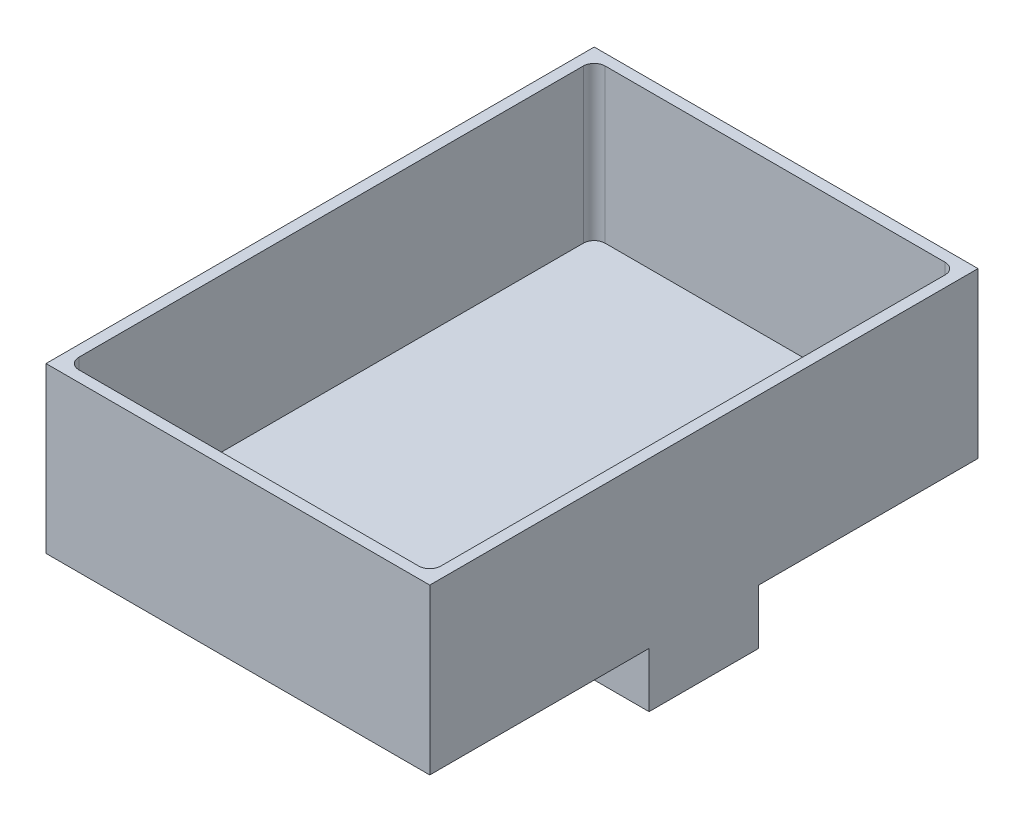
ISO-10303-21;
HEADER;
FILE_DESCRIPTION(('STEP AP214'),'2;1');
FILE_NAME('part.step','',(''),(''),'','','');
FILE_SCHEMA(('AUTOMOTIVE_DESIGN { 1 0 10303 214 1 1 1 1 }'));
ENDSEC;
DATA;
#1=APPLICATION_CONTEXT('core data for automotive mechanical design processes');
#2=APPLICATION_PROTOCOL_DEFINITION('international standard','automotive_design',2000,#1);
#3=PRODUCT_CONTEXT('',#1,'mechanical');
#4=PRODUCT('Part','Part','',(#3));
#5=PRODUCT_RELATED_PRODUCT_CATEGORY('part','',(#4));
#6=PRODUCT_DEFINITION_FORMATION('','',#4);
#7=PRODUCT_DEFINITION_CONTEXT('part definition',#1,'design');
#8=PRODUCT_DEFINITION('design','',#6,#7);
#9=PRODUCT_DEFINITION_SHAPE('','',#8);
#10=(LENGTH_UNIT() NAMED_UNIT(*) SI_UNIT(.MILLI.,.METRE.));
#11=(NAMED_UNIT(*) PLANE_ANGLE_UNIT() SI_UNIT($,.RADIAN.));
#12=(NAMED_UNIT(*) SI_UNIT($,.STERADIAN.) SOLID_ANGLE_UNIT());
#13=UNCERTAINTY_MEASURE_WITH_UNIT(LENGTH_MEASURE(1.E-05),#10,'distance_accuracy_value','');
#14=(GEOMETRIC_REPRESENTATION_CONTEXT(3) GLOBAL_UNCERTAINTY_ASSIGNED_CONTEXT((#13)) GLOBAL_UNIT_ASSIGNED_CONTEXT((#10,
#11,#12)) REPRESENTATION_CONTEXT('',''));
#15=CARTESIAN_POINT('',(0.,0.,0.));
#16=DIRECTION('',(0.,0.,1.));
#17=DIRECTION('',(1.,0.,0.));
#18=AXIS2_PLACEMENT_3D('',#15,#16,#17);
#19=CARTESIAN_POINT('',(70.,40.,0.));
#20=DIRECTION('',(0.,-1.,0.));
#21=DIRECTION('',(0.,0.,-1.));
#22=AXIS2_PLACEMENT_3D('',#19,#20,#21);
#23=PLANE('',#22);
#24=DIRECTION('',(0.,0.,1.));
#25=VECTOR('',#24,1.);
#26=CARTESIAN_POINT('',(0.,40.,0.));
#27=LINE('',#26,#25);
#28=CARTESIAN_POINT('',(0.,40.,-100.));
#29=VERTEX_POINT('',#28);
#30=CARTESIAN_POINT('',(0.,40.,0.));
#31=VERTEX_POINT('',#30);
#32=EDGE_CURVE('E258',#29,#31,#27,.T.);
#33=ORIENTED_EDGE('',*,*,#32,.T.);
#34=DIRECTION('',(-1.,0.,0.));
#35=VECTOR('',#34,1.);
#36=CARTESIAN_POINT('',(70.,40.,0.));
#37=LINE('',#36,#35);
#38=CARTESIAN_POINT('',(70.,40.,0.));
#39=VERTEX_POINT('',#38);
#40=EDGE_CURVE('E153',#39,#31,#37,.T.);
#41=ORIENTED_EDGE('',*,*,#40,.F.);
#42=DIRECTION('',(0.,0.,1.));
#43=VECTOR('',#42,1.);
#44=CARTESIAN_POINT('',(70.,40.,0.));
#45=LINE('',#44,#43);
#46=CARTESIAN_POINT('',(70.,40.,-100.));
#47=VERTEX_POINT('',#46);
#48=EDGE_CURVE('E147',#47,#39,#45,.T.);
#49=ORIENTED_EDGE('',*,*,#48,.F.);
#50=DIRECTION('',(-1.,0.,0.));
#51=VECTOR('',#50,1.);
#52=CARTESIAN_POINT('',(70.,40.,-100.));
#53=LINE('',#52,#51);
#54=EDGE_CURVE('E150',#47,#29,#53,.T.);
#55=ORIENTED_EDGE('',*,*,#54,.T.);
#56=EDGE_LOOP('',(#33,#41,#49,#55));
#57=FACE_BOUND('',#56,.T.);
#58=DIRECTION('',(0.,0.,1.));
#59=VECTOR('',#58,1.);
#60=CARTESIAN_POINT('',(2.,40.,0.));
#61=LINE('',#60,#59);
#62=CARTESIAN_POINT('',(2.,40.,-96.));
#63=VERTEX_POINT('',#62);
#64=CARTESIAN_POINT('',(2.,40.,-4.));
#65=VERTEX_POINT('',#64);
#66=EDGE_CURVE('E239',#63,#65,#61,.T.);
#67=ORIENTED_EDGE('',*,*,#66,.F.);
#68=CARTESIAN_POINT('',(4.,40.,-96.));
#69=DIRECTION('',(0.,-1.,0.));
#70=DIRECTION('',(0.,0.,-1.));
#71=AXIS2_PLACEMENT_3D('',#68,#69,#70);
#72=CIRCLE('',#71,2.);
#73=CARTESIAN_POINT('',(4.,40.,-98.));
#74=VERTEX_POINT('',#73);
#75=EDGE_CURVE('E11',#63,#74,#72,.T.);
#76=ORIENTED_EDGE('',*,*,#75,.T.);
#77=DIRECTION('',(-1.,0.,0.));
#78=VECTOR('',#77,1.);
#79=CARTESIAN_POINT('',(70.,40.,-98.));
#80=LINE('',#79,#78);
#81=CARTESIAN_POINT('',(66.,40.,-98.));
#82=VERTEX_POINT('',#81);
#83=EDGE_CURVE('E210',#82,#74,#80,.T.);
#84=ORIENTED_EDGE('',*,*,#83,.F.);
#85=CARTESIAN_POINT('',(66.,40.,-96.));
#86=DIRECTION('',(0.,-1.,0.));
#87=DIRECTION('',(0.,0.,-1.));
#88=AXIS2_PLACEMENT_3D('',#85,#86,#87);
#89=CIRCLE('',#88,2.);
#90=CARTESIAN_POINT('',(68.,40.,-96.));
#91=VERTEX_POINT('',#90);
#92=EDGE_CURVE('E43',#82,#91,#89,.T.);
#93=ORIENTED_EDGE('',*,*,#92,.T.);
#94=DIRECTION('',(0.,0.,1.));
#95=VECTOR('',#94,1.);
#96=CARTESIAN_POINT('',(68.,40.,0.));
#97=LINE('',#96,#95);
#98=CARTESIAN_POINT('',(68.,40.,-4.));
#99=VERTEX_POINT('',#98);
#100=EDGE_CURVE('E208',#91,#99,#97,.T.);
#101=ORIENTED_EDGE('',*,*,#100,.T.);
#102=CARTESIAN_POINT('',(66.,40.,-4.));
#103=DIRECTION('',(0.,-1.,0.));
#104=DIRECTION('',(0.,0.,-1.));
#105=AXIS2_PLACEMENT_3D('',#102,#103,#104);
#106=CIRCLE('',#105,2.);
#107=CARTESIAN_POINT('',(66.,40.,-2.));
#108=VERTEX_POINT('',#107);
#109=EDGE_CURVE('E203',#99,#108,#106,.T.);
#110=ORIENTED_EDGE('',*,*,#109,.T.);
#111=DIRECTION('',(-1.,0.,0.));
#112=VECTOR('',#111,1.);
#113=CARTESIAN_POINT('',(70.,40.,-2.));
#114=LINE('',#113,#112);
#115=CARTESIAN_POINT('',(4.,40.,-2.));
#116=VERTEX_POINT('',#115);
#117=EDGE_CURVE('E234',#108,#116,#114,.T.);
#118=ORIENTED_EDGE('',*,*,#117,.T.);
#119=CARTESIAN_POINT('',(4.,40.,-4.));
#120=DIRECTION('',(0.,-1.,0.));
#121=DIRECTION('',(0.,0.,-1.));
#122=AXIS2_PLACEMENT_3D('',#119,#120,#121);
#123=CIRCLE('',#122,2.);
#124=EDGE_CURVE('E205',#116,#65,#123,.T.);
#125=ORIENTED_EDGE('',*,*,#124,.T.);
#126=EDGE_LOOP('',(#67,#76,#84,#93,#101,#110,#118,#125));
#127=FACE_BOUND('',#126,.T.);
#128=ADVANCED_FACE('F35',(#57,#127),#23,.F.);
#129=CARTESIAN_POINT('',(70.,10.,-100.));
#130=DIRECTION('',(0.,0.,1.));
#131=DIRECTION('',(1.,0.,0.));
#132=AXIS2_PLACEMENT_3D('',#129,#130,#131);
#133=PLANE('',#132);
#134=DIRECTION('',(0.,1.,0.));
#135=VECTOR('',#134,1.);
#136=CARTESIAN_POINT('',(0.,10.,-100.));
#137=LINE('',#136,#135);
#138=CARTESIAN_POINT('',(0.,10.,-100.));
#139=VERTEX_POINT('',#138);
#140=EDGE_CURVE('E170',#139,#29,#137,.T.);
#141=ORIENTED_EDGE('',*,*,#140,.T.);
#142=ORIENTED_EDGE('',*,*,#54,.F.);
#143=DIRECTION('',(0.,1.,0.));
#144=VECTOR('',#143,1.);
#145=CARTESIAN_POINT('',(70.,10.,-100.));
#146=LINE('',#145,#144);
#147=CARTESIAN_POINT('',(70.,10.,-100.));
#148=VERTEX_POINT('',#147);
#149=EDGE_CURVE('E157',#148,#47,#146,.T.);
#150=ORIENTED_EDGE('',*,*,#149,.F.);
#151=DIRECTION('',(-1.,0.,0.));
#152=VECTOR('',#151,1.);
#153=CARTESIAN_POINT('',(70.,10.,-100.));
#154=LINE('',#153,#152);
#155=EDGE_CURVE('E256',#148,#139,#154,.T.);
#156=ORIENTED_EDGE('',*,*,#155,.T.);
#157=EDGE_LOOP('',(#141,#142,#150,#156));
#158=FACE_BOUND('',#157,.T.);
#159=ADVANCED_FACE('F168',(#158),#133,.F.);
#160=CARTESIAN_POINT('',(70.,10.,0.));
#161=DIRECTION('',(0.,0.,-1.));
#162=DIRECTION('',(-1.,0.,0.));
#163=AXIS2_PLACEMENT_3D('',#160,#161,#162);
#164=PLANE('',#163);
#165=DIRECTION('',(0.,-1.,0.));
#166=VECTOR('',#165,1.);
#167=CARTESIAN_POINT('',(0.,10.,0.));
#168=LINE('',#167,#166);
#169=CARTESIAN_POINT('',(0.,10.,0.));
#170=VERTEX_POINT('',#169);
#171=EDGE_CURVE('E260',#31,#170,#168,.T.);
#172=ORIENTED_EDGE('',*,*,#171,.T.);
#173=DIRECTION('',(-1.,0.,0.));
#174=VECTOR('',#173,1.);
#175=CARTESIAN_POINT('',(70.,10.,0.));
#176=LINE('',#175,#174);
#177=CARTESIAN_POINT('',(70.,10.,0.));
#178=VERTEX_POINT('',#177);
#179=EDGE_CURVE('E175',#178,#170,#176,.T.);
#180=ORIENTED_EDGE('',*,*,#179,.F.);
#181=DIRECTION('',(0.,-1.,0.));
#182=VECTOR('',#181,1.);
#183=CARTESIAN_POINT('',(70.,10.,0.));
#184=LINE('',#183,#182);
#185=EDGE_CURVE('E156',#39,#178,#184,.T.);
#186=ORIENTED_EDGE('',*,*,#185,.F.);
#187=ORIENTED_EDGE('',*,*,#40,.T.);
#188=EDGE_LOOP('',(#172,#180,#186,#187));
#189=FACE_BOUND('',#188,.T.);
#190=ADVANCED_FACE('F307',(#189),#164,.F.);
#191=CARTESIAN_POINT('',(70.,10.,0.));
#192=DIRECTION('',(0.,1.,0.));
#193=DIRECTION('',(0.,0.,1.));
#194=AXIS2_PLACEMENT_3D('',#191,#192,#193);
#195=PLANE('',#194);
#196=DIRECTION('',(0.,0.,-1.));
#197=VECTOR('',#196,1.);
#198=CARTESIAN_POINT('',(0.,10.,0.));
#199=LINE('',#198,#197);
#200=CARTESIAN_POINT('',(0.,10.,-40.));
#201=VERTEX_POINT('',#200);
#202=EDGE_CURVE('E262',#170,#201,#199,.T.);
#203=ORIENTED_EDGE('',*,*,#202,.T.);
#204=DIRECTION('',(-1.,0.,0.));
#205=VECTOR('',#204,1.);
#206=CARTESIAN_POINT('',(70.,10.,-40.));
#207=LINE('',#206,#205);
#208=CARTESIAN_POINT('',(70.,10.,-40.));
#209=VERTEX_POINT('',#208);
#210=EDGE_CURVE('E281',#209,#201,#207,.T.);
#211=ORIENTED_EDGE('',*,*,#210,.F.);
#212=DIRECTION('',(0.,0.,-1.));
#213=VECTOR('',#212,1.);
#214=CARTESIAN_POINT('',(70.,10.,0.));
#215=LINE('',#214,#213);
#216=EDGE_CURVE('E247',#178,#209,#215,.T.);
#217=ORIENTED_EDGE('',*,*,#216,.F.);
#218=ORIENTED_EDGE('',*,*,#179,.T.);
#219=EDGE_LOOP('',(#203,#211,#217,#218));
#220=FACE_BOUND('',#219,.T.);
#221=ADVANCED_FACE('F288',(#220),#195,.F.);
#222=CARTESIAN_POINT('',(70.,0.,-40.));
#223=DIRECTION('',(0.,0.,-1.));
#224=DIRECTION('',(-1.,0.,0.));
#225=AXIS2_PLACEMENT_3D('',#222,#223,#224);
#226=PLANE('',#225);
#227=DIRECTION('',(0.,-1.,0.));
#228=VECTOR('',#227,1.);
#229=CARTESIAN_POINT('',(0.,0.,-40.));
#230=LINE('',#229,#228);
#231=CARTESIAN_POINT('',(0.,0.,-40.));
#232=VERTEX_POINT('',#231);
#233=EDGE_CURVE('E264',#201,#232,#230,.T.);
#234=ORIENTED_EDGE('',*,*,#233,.T.);
#235=DIRECTION('',(-1.,0.,0.));
#236=VECTOR('',#235,1.);
#237=CARTESIAN_POINT('',(70.,0.,-40.));
#238=LINE('',#237,#236);
#239=CARTESIAN_POINT('',(70.,0.,-40.));
#240=VERTEX_POINT('',#239);
#241=EDGE_CURVE('E278',#240,#232,#238,.T.);
#242=ORIENTED_EDGE('',*,*,#241,.F.);
#243=DIRECTION('',(0.,-1.,0.));
#244=VECTOR('',#243,1.);
#245=CARTESIAN_POINT('',(70.,0.,-40.));
#246=LINE('',#245,#244);
#247=EDGE_CURVE('E249',#209,#240,#246,.T.);
#248=ORIENTED_EDGE('',*,*,#247,.F.);
#249=ORIENTED_EDGE('',*,*,#210,.T.);
#250=EDGE_LOOP('',(#234,#242,#248,#249));
#251=FACE_BOUND('',#250,.T.);
#252=ADVANCED_FACE('F299',(#251),#226,.F.);
#253=CARTESIAN_POINT('',(70.,0.,-40.));
#254=DIRECTION('',(0.,1.,0.));
#255=DIRECTION('',(0.,0.,1.));
#256=AXIS2_PLACEMENT_3D('',#253,#254,#255);
#257=PLANE('',#256);
#258=DIRECTION('',(0.,0.,-1.));
#259=VECTOR('',#258,1.);
#260=CARTESIAN_POINT('',(0.,0.,-40.));
#261=LINE('',#260,#259);
#262=CARTESIAN_POINT('',(0.,0.,-60.));
#263=VERTEX_POINT('',#262);
#264=EDGE_CURVE('E266',#232,#263,#261,.T.);
#265=ORIENTED_EDGE('',*,*,#264,.T.);
#266=DIRECTION('',(-1.,0.,0.));
#267=VECTOR('',#266,1.);
#268=CARTESIAN_POINT('',(70.,0.,-60.));
#269=LINE('',#268,#267);
#270=CARTESIAN_POINT('',(70.,0.,-60.));
#271=VERTEX_POINT('',#270);
#272=EDGE_CURVE('E275',#271,#263,#269,.T.);
#273=ORIENTED_EDGE('',*,*,#272,.F.);
#274=DIRECTION('',(0.,0.,-1.));
#275=VECTOR('',#274,1.);
#276=CARTESIAN_POINT('',(70.,0.,-40.));
#277=LINE('',#276,#275);
#278=EDGE_CURVE('E251',#240,#271,#277,.T.);
#279=ORIENTED_EDGE('',*,*,#278,.F.);
#280=ORIENTED_EDGE('',*,*,#241,.T.);
#281=EDGE_LOOP('',(#265,#273,#279,#280));
#282=FACE_BOUND('',#281,.T.);
#283=ADVANCED_FACE('F303',(#282),#257,.F.);
#284=CARTESIAN_POINT('',(70.,0.,-60.));
#285=DIRECTION('',(0.,0.,1.));
#286=DIRECTION('',(1.,0.,0.));
#287=AXIS2_PLACEMENT_3D('',#284,#285,#286);
#288=PLANE('',#287);
#289=DIRECTION('',(0.,1.,0.));
#290=VECTOR('',#289,1.);
#291=CARTESIAN_POINT('',(0.,0.,-60.));
#292=LINE('',#291,#290);
#293=CARTESIAN_POINT('',(0.,10.,-60.));
#294=VERTEX_POINT('',#293);
#295=EDGE_CURVE('E268',#263,#294,#292,.T.);
#296=ORIENTED_EDGE('',*,*,#295,.T.);
#297=DIRECTION('',(-1.,0.,0.));
#298=VECTOR('',#297,1.);
#299=CARTESIAN_POINT('',(70.,10.,-60.));
#300=LINE('',#299,#298);
#301=CARTESIAN_POINT('',(70.,10.,-60.));
#302=VERTEX_POINT('',#301);
#303=EDGE_CURVE('E272',#302,#294,#300,.T.);
#304=ORIENTED_EDGE('',*,*,#303,.F.);
#305=DIRECTION('',(0.,1.,0.));
#306=VECTOR('',#305,1.);
#307=CARTESIAN_POINT('',(70.,0.,-60.));
#308=LINE('',#307,#306);
#309=EDGE_CURVE('E253',#271,#302,#308,.T.);
#310=ORIENTED_EDGE('',*,*,#309,.F.);
#311=ORIENTED_EDGE('',*,*,#272,.T.);
#312=EDGE_LOOP('',(#296,#304,#310,#311));
#313=FACE_BOUND('',#312,.T.);
#314=ADVANCED_FACE('F366',(#313),#288,.F.);
#315=CARTESIAN_POINT('',(70.,10.,-100.));
#316=DIRECTION('',(0.,1.,0.));
#317=DIRECTION('',(0.,0.,1.));
#318=AXIS2_PLACEMENT_3D('',#315,#316,#317);
#319=PLANE('',#318);
#320=DIRECTION('',(0.,0.,-1.));
#321=VECTOR('',#320,1.);
#322=CARTESIAN_POINT('',(0.,10.,-100.));
#323=LINE('',#322,#321);
#324=EDGE_CURVE('E166',#294,#139,#323,.T.);
#325=ORIENTED_EDGE('',*,*,#324,.T.);
#326=ORIENTED_EDGE('',*,*,#155,.F.);
#327=DIRECTION('',(0.,0.,-1.));
#328=VECTOR('',#327,1.);
#329=CARTESIAN_POINT('',(70.,10.,-100.));
#330=LINE('',#329,#328);
#331=EDGE_CURVE('E162',#302,#148,#330,.T.);
#332=ORIENTED_EDGE('',*,*,#331,.F.);
#333=ORIENTED_EDGE('',*,*,#303,.T.);
#334=EDGE_LOOP('',(#325,#326,#332,#333));
#335=FACE_BOUND('',#334,.T.);
#336=ADVANCED_FACE('F361',(#335),#319,.F.);
#337=CARTESIAN_POINT('',(70.,0.,0.));
#338=DIRECTION('',(-1.,0.,0.));
#339=DIRECTION('',(0.,0.,1.));
#340=AXIS2_PLACEMENT_3D('',#337,#338,#339);
#341=PLANE('',#340);
#342=ORIENTED_EDGE('',*,*,#149,.T.);
#343=ORIENTED_EDGE('',*,*,#48,.T.);
#344=ORIENTED_EDGE('',*,*,#185,.T.);
#345=ORIENTED_EDGE('',*,*,#216,.T.);
#346=ORIENTED_EDGE('',*,*,#247,.T.);
#347=ORIENTED_EDGE('',*,*,#278,.T.);
#348=ORIENTED_EDGE('',*,*,#309,.T.);
#349=ORIENTED_EDGE('',*,*,#331,.T.);
#350=EDGE_LOOP('',(#342,#343,#344,#345,#346,#347,#348,#349));
#351=FACE_BOUND('',#350,.T.);
#352=ADVANCED_FACE('F160',(#351),#341,.F.);
#353=CARTESIAN_POINT('',(0.,0.,0.));
#354=DIRECTION('',(-1.,0.,0.));
#355=DIRECTION('',(0.,0.,1.));
#356=AXIS2_PLACEMENT_3D('',#353,#354,#355);
#357=PLANE('',#356);
#358=ORIENTED_EDGE('',*,*,#140,.F.);
#359=ORIENTED_EDGE('',*,*,#324,.F.);
#360=ORIENTED_EDGE('',*,*,#295,.F.);
#361=ORIENTED_EDGE('',*,*,#264,.F.);
#362=ORIENTED_EDGE('',*,*,#233,.F.);
#363=ORIENTED_EDGE('',*,*,#202,.F.);
#364=ORIENTED_EDGE('',*,*,#171,.F.);
#365=ORIENTED_EDGE('',*,*,#32,.F.);
#366=EDGE_LOOP('',(#358,#359,#360,#361,#362,#363,#364,#365));
#367=FACE_BOUND('',#366,.T.);
#368=ADVANCED_FACE('F294',(#367),#357,.T.);
#369=CARTESIAN_POINT('',(70.,10.,-98.));
#370=DIRECTION('',(0.,0.,1.));
#371=DIRECTION('',(1.,0.,0.));
#372=AXIS2_PLACEMENT_3D('',#369,#370,#371);
#373=PLANE('',#372);
#374=DIRECTION('',(-1.,0.,0.));
#375=VECTOR('',#374,1.);
#376=CARTESIAN_POINT('',(70.,12.,-98.));
#377=LINE('',#376,#375);
#378=CARTESIAN_POINT('',(66.,12.,-98.));
#379=VERTEX_POINT('',#378);
#380=CARTESIAN_POINT('',(4.,12.,-98.));
#381=VERTEX_POINT('',#380);
#382=EDGE_CURVE('E226',#379,#381,#377,.T.);
#383=ORIENTED_EDGE('',*,*,#382,.F.);
#384=DIRECTION('',(0.,1.,0.));
#385=VECTOR('',#384,1.);
#386=CARTESIAN_POINT('',(66.,40.,-98.));
#387=LINE('',#386,#385);
#388=EDGE_CURVE('E201',#379,#82,#387,.T.);
#389=ORIENTED_EDGE('',*,*,#388,.T.);
#390=ORIENTED_EDGE('',*,*,#83,.T.);
#391=DIRECTION('',(0.,1.,0.));
#392=VECTOR('',#391,1.);
#393=CARTESIAN_POINT('',(4.,10.,-98.));
#394=LINE('',#393,#392);
#395=EDGE_CURVE('E199',#74,#381,#394,.F.);
#396=ORIENTED_EDGE('',*,*,#395,.T.);
#397=EDGE_LOOP('',(#383,#389,#390,#396));
#398=FACE_BOUND('',#397,.T.);
#399=ADVANCED_FACE('F229',(#398),#373,.T.);
#400=CARTESIAN_POINT('',(70.,10.,-2.));
#401=DIRECTION('',(0.,0.,-1.));
#402=DIRECTION('',(-1.,0.,0.));
#403=AXIS2_PLACEMENT_3D('',#400,#401,#402);
#404=PLANE('',#403);
#405=ORIENTED_EDGE('',*,*,#117,.F.);
#406=DIRECTION('',(0.,-1.,0.));
#407=VECTOR('',#406,1.);
#408=CARTESIAN_POINT('',(66.,12.,-2.));
#409=LINE('',#408,#407);
#410=CARTESIAN_POINT('',(66.,12.,-2.));
#411=VERTEX_POINT('',#410);
#412=EDGE_CURVE('E173',#108,#411,#409,.T.);
#413=ORIENTED_EDGE('',*,*,#412,.T.);
#414=DIRECTION('',(-1.,0.,0.));
#415=VECTOR('',#414,1.);
#416=CARTESIAN_POINT('',(70.,12.,-2.));
#417=LINE('',#416,#415);
#418=CARTESIAN_POINT('',(4.,12.,-2.));
#419=VERTEX_POINT('',#418);
#420=EDGE_CURVE('E231',#411,#419,#417,.T.);
#421=ORIENTED_EDGE('',*,*,#420,.T.);
#422=DIRECTION('',(0.,-1.,0.));
#423=VECTOR('',#422,1.);
#424=CARTESIAN_POINT('',(4.,10.,-2.));
#425=LINE('',#424,#423);
#426=EDGE_CURVE('E171',#419,#116,#425,.F.);
#427=ORIENTED_EDGE('',*,*,#426,.T.);
#428=EDGE_LOOP('',(#405,#413,#421,#427));
#429=FACE_BOUND('',#428,.T.);
#430=ADVANCED_FACE('F344',(#429),#404,.T.);
#431=CARTESIAN_POINT('',(70.,12.,-100.));
#432=DIRECTION('',(0.,1.,0.));
#433=DIRECTION('',(0.,0.,1.));
#434=AXIS2_PLACEMENT_3D('',#431,#432,#433);
#435=PLANE('',#434);
#436=ORIENTED_EDGE('',*,*,#420,.F.);
#437=CARTESIAN_POINT('',(66.,12.,-4.));
#438=DIRECTION('',(0.,1.,0.));
#439=DIRECTION('',(0.,0.,1.));
#440=AXIS2_PLACEMENT_3D('',#437,#438,#439);
#441=CIRCLE('',#440,2.);
#442=CARTESIAN_POINT('',(68.,12.,-4.));
#443=VERTEX_POINT('',#442);
#444=EDGE_CURVE('E187',#411,#443,#441,.T.);
#445=ORIENTED_EDGE('',*,*,#444,.T.);
#446=DIRECTION('',(0.,0.,-1.));
#447=VECTOR('',#446,1.);
#448=CARTESIAN_POINT('',(68.,12.,0.));
#449=LINE('',#448,#447);
#450=CARTESIAN_POINT('',(68.,12.,-96.));
#451=VERTEX_POINT('',#450);
#452=EDGE_CURVE('E216',#443,#451,#449,.T.);
#453=ORIENTED_EDGE('',*,*,#452,.T.);
#454=CARTESIAN_POINT('',(66.,12.,-96.));
#455=DIRECTION('',(0.,1.,0.));
#456=DIRECTION('',(0.,0.,1.));
#457=AXIS2_PLACEMENT_3D('',#454,#455,#456);
#458=CIRCLE('',#457,2.);
#459=EDGE_CURVE('E183',#451,#379,#458,.T.);
#460=ORIENTED_EDGE('',*,*,#459,.T.);
#461=ORIENTED_EDGE('',*,*,#382,.T.);
#462=CARTESIAN_POINT('',(4.,12.,-96.));
#463=DIRECTION('',(0.,1.,0.));
#464=DIRECTION('',(0.,0.,1.));
#465=AXIS2_PLACEMENT_3D('',#462,#463,#464);
#466=CIRCLE('',#465,2.);
#467=CARTESIAN_POINT('',(2.,12.,-96.));
#468=VERTEX_POINT('',#467);
#469=EDGE_CURVE('E181',#381,#468,#466,.T.);
#470=ORIENTED_EDGE('',*,*,#469,.T.);
#471=DIRECTION('',(0.,0.,-1.));
#472=VECTOR('',#471,1.);
#473=CARTESIAN_POINT('',(2.,12.,0.));
#474=LINE('',#473,#472);
#475=CARTESIAN_POINT('',(2.,12.,-4.));
#476=VERTEX_POINT('',#475);
#477=EDGE_CURVE('E217',#476,#468,#474,.T.);
#478=ORIENTED_EDGE('',*,*,#477,.F.);
#479=CARTESIAN_POINT('',(4.,12.,-4.));
#480=DIRECTION('',(0.,1.,0.));
#481=DIRECTION('',(0.,0.,1.));
#482=AXIS2_PLACEMENT_3D('',#479,#480,#481);
#483=CIRCLE('',#482,2.);
#484=EDGE_CURVE('E185',#476,#419,#483,.T.);
#485=ORIENTED_EDGE('',*,*,#484,.T.);
#486=EDGE_LOOP('',(#436,#445,#453,#460,#461,#470,#478,#485));
#487=FACE_BOUND('',#486,.T.);
#488=ADVANCED_FACE('F225',(#487),#435,.T.);
#489=CARTESIAN_POINT('',(68.,0.,0.));
#490=DIRECTION('',(-1.,0.,0.));
#491=DIRECTION('',(0.,0.,1.));
#492=AXIS2_PLACEMENT_3D('',#489,#490,#491);
#493=PLANE('',#492);
#494=ORIENTED_EDGE('',*,*,#452,.F.);
#495=DIRECTION('',(0.,-1.,0.));
#496=VECTOR('',#495,1.);
#497=CARTESIAN_POINT('',(68.,40.,-4.));
#498=LINE('',#497,#496);
#499=EDGE_CURVE('E191',#443,#99,#498,.F.);
#500=ORIENTED_EDGE('',*,*,#499,.T.);
#501=ORIENTED_EDGE('',*,*,#100,.F.);
#502=DIRECTION('',(0.,1.,0.));
#503=VECTOR('',#502,1.);
#504=CARTESIAN_POINT('',(68.,12.,-96.));
#505=LINE('',#504,#503);
#506=EDGE_CURVE('E189',#91,#451,#505,.F.);
#507=ORIENTED_EDGE('',*,*,#506,.T.);
#508=EDGE_LOOP('',(#494,#500,#501,#507));
#509=FACE_BOUND('',#508,.T.);
#510=ADVANCED_FACE('F213',(#509),#493,.T.);
#511=CARTESIAN_POINT('',(2.,0.,0.));
#512=DIRECTION('',(-1.,0.,0.));
#513=DIRECTION('',(0.,0.,1.));
#514=AXIS2_PLACEMENT_3D('',#511,#512,#513);
#515=PLANE('',#514);
#516=ORIENTED_EDGE('',*,*,#66,.T.);
#517=DIRECTION('',(0.,-1.,0.));
#518=VECTOR('',#517,1.);
#519=CARTESIAN_POINT('',(2.,0.,-4.));
#520=LINE('',#519,#518);
#521=EDGE_CURVE('E196',#65,#476,#520,.T.);
#522=ORIENTED_EDGE('',*,*,#521,.T.);
#523=ORIENTED_EDGE('',*,*,#477,.T.);
#524=DIRECTION('',(0.,1.,0.));
#525=VECTOR('',#524,1.);
#526=CARTESIAN_POINT('',(2.,0.,-96.));
#527=LINE('',#526,#525);
#528=EDGE_CURVE('E193',#468,#63,#527,.T.);
#529=ORIENTED_EDGE('',*,*,#528,.T.);
#530=EDGE_LOOP('',(#516,#522,#523,#529));
#531=FACE_BOUND('',#530,.T.);
#532=ADVANCED_FACE('F325',(#531),#515,.F.);
#533=CARTESIAN_POINT('',(66.,10.,-4.));
#534=DIRECTION('',(0.,1.,0.));
#535=DIRECTION('',(0.,0.,1.));
#536=AXIS2_PLACEMENT_3D('',#533,#534,#535);
#537=CYLINDRICAL_SURFACE('',#536,2.);
#538=ORIENTED_EDGE('',*,*,#109,.F.);
#539=ORIENTED_EDGE('',*,*,#499,.F.);
#540=ORIENTED_EDGE('',*,*,#444,.F.);
#541=ORIENTED_EDGE('',*,*,#412,.F.);
#542=EDGE_LOOP('',(#538,#539,#540,#541));
#543=FACE_BOUND('',#542,.T.);
#544=ADVANCED_FACE('F321',(#543),#537,.F.);
#545=CARTESIAN_POINT('',(4.,0.,-4.));
#546=DIRECTION('',(0.,-1.,0.));
#547=DIRECTION('',(0.,0.,-1.));
#548=AXIS2_PLACEMENT_3D('',#545,#546,#547);
#549=CYLINDRICAL_SURFACE('',#548,2.);
#550=ORIENTED_EDGE('',*,*,#124,.F.);
#551=ORIENTED_EDGE('',*,*,#426,.F.);
#552=ORIENTED_EDGE('',*,*,#484,.F.);
#553=ORIENTED_EDGE('',*,*,#521,.F.);
#554=EDGE_LOOP('',(#550,#551,#552,#553));
#555=FACE_BOUND('',#554,.T.);
#556=ADVANCED_FACE('F324',(#555),#549,.F.);
#557=CARTESIAN_POINT('',(66.,10.,-96.));
#558=DIRECTION('',(0.,-1.,0.));
#559=DIRECTION('',(0.,0.,-1.));
#560=AXIS2_PLACEMENT_3D('',#557,#558,#559);
#561=CYLINDRICAL_SURFACE('',#560,2.);
#562=ORIENTED_EDGE('',*,*,#459,.F.);
#563=ORIENTED_EDGE('',*,*,#506,.F.);
#564=ORIENTED_EDGE('',*,*,#92,.F.);
#565=ORIENTED_EDGE('',*,*,#388,.F.);
#566=EDGE_LOOP('',(#562,#563,#564,#565));
#567=FACE_BOUND('',#566,.T.);
#568=ADVANCED_FACE('F220',(#567),#561,.F.);
#569=CARTESIAN_POINT('',(4.,0.,-96.));
#570=DIRECTION('',(0.,1.,0.));
#571=DIRECTION('',(0.,0.,1.));
#572=AXIS2_PLACEMENT_3D('',#569,#570,#571);
#573=CYLINDRICAL_SURFACE('',#572,2.);
#574=ORIENTED_EDGE('',*,*,#469,.F.);
#575=ORIENTED_EDGE('',*,*,#395,.F.);
#576=ORIENTED_EDGE('',*,*,#75,.F.);
#577=ORIENTED_EDGE('',*,*,#528,.F.);
#578=EDGE_LOOP('',(#574,#575,#576,#577));
#579=FACE_BOUND('',#578,.T.);
#580=ADVANCED_FACE('F37',(#579),#573,.F.);
#581=CLOSED_SHELL('',(#128,#159,#190,#221,#252,#283,#314,#336,#352,#368,#399,#430,#488,#510,
#532,#544,#556,#568,#580));
#582=MANIFOLD_SOLID_BREP('B2',#581);
#583=ADVANCED_BREP_SHAPE_REPRESENTATION('',(#18,#582),#14);
#584=SHAPE_DEFINITION_REPRESENTATION(#9,#583);
ENDSEC;
END-ISO-10303-21;
